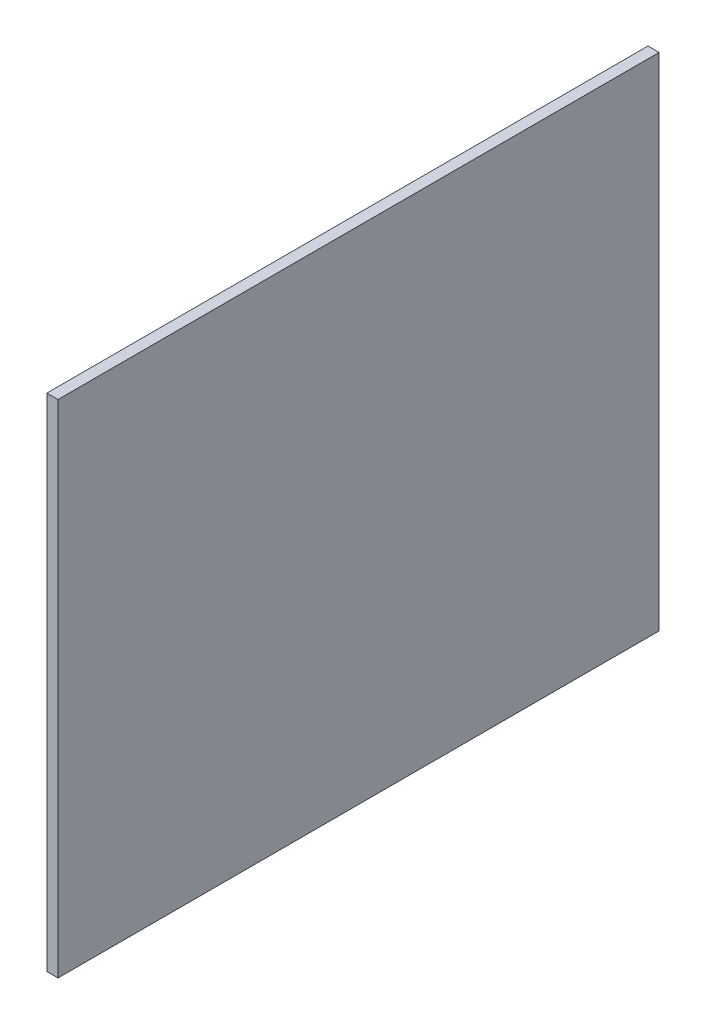
ISO-10303-21;
HEADER;
FILE_DESCRIPTION(('STEP AP214'),'2;1');
FILE_NAME('part.step','',(''),(''),'','','');
FILE_SCHEMA(('AUTOMOTIVE_DESIGN { 1 0 10303 214 1 1 1 1 }'));
ENDSEC;
DATA;
#1=APPLICATION_CONTEXT('core data for automotive mechanical design processes');
#2=APPLICATION_PROTOCOL_DEFINITION('international standard','automotive_design',2000,#1);
#3=PRODUCT_CONTEXT('',#1,'mechanical');
#4=PRODUCT('Part','Part','',(#3));
#5=PRODUCT_RELATED_PRODUCT_CATEGORY('part','',(#4));
#6=PRODUCT_DEFINITION_FORMATION('','',#4);
#7=PRODUCT_DEFINITION_CONTEXT('part definition',#1,'design');
#8=PRODUCT_DEFINITION('design','',#6,#7);
#9=PRODUCT_DEFINITION_SHAPE('','',#8);
#10=(LENGTH_UNIT() NAMED_UNIT(*) SI_UNIT(.MILLI.,.METRE.));
#11=(NAMED_UNIT(*) PLANE_ANGLE_UNIT() SI_UNIT($,.RADIAN.));
#12=(NAMED_UNIT(*) SI_UNIT($,.STERADIAN.) SOLID_ANGLE_UNIT());
#13=UNCERTAINTY_MEASURE_WITH_UNIT(LENGTH_MEASURE(1.E-05),#10,'distance_accuracy_value','');
#14=(GEOMETRIC_REPRESENTATION_CONTEXT(3) GLOBAL_UNCERTAINTY_ASSIGNED_CONTEXT((#13)) GLOBAL_UNIT_ASSIGNED_CONTEXT((#10,
#11,#12)) REPRESENTATION_CONTEXT('',''));
#15=CARTESIAN_POINT('',(0.,0.,0.));
#16=DIRECTION('',(0.,0.,1.));
#17=DIRECTION('',(1.,0.,0.));
#18=AXIS2_PLACEMENT_3D('',#15,#16,#17);
#19=CARTESIAN_POINT('',(8.,0.,0.));
#20=DIRECTION('',(0.,0.,-1.));
#21=DIRECTION('',(-1.,0.,0.));
#22=AXIS2_PLACEMENT_3D('',#19,#20,#21);
#23=PLANE('',#22);
#24=DIRECTION('',(0.,-1.,0.));
#25=VECTOR('',#24,1.);
#26=CARTESIAN_POINT('',(0.,0.,0.));
#27=LINE('',#26,#25);
#28=CARTESIAN_POINT('',(0.,360.,0.));
#29=VERTEX_POINT('',#28);
#30=CARTESIAN_POINT('',(0.,0.,0.));
#31=VERTEX_POINT('',#30);
#32=EDGE_CURVE('E96',#29,#31,#27,.T.);
#33=ORIENTED_EDGE('',*,*,#32,.T.);
#34=DIRECTION('',(-1.,0.,0.));
#35=VECTOR('',#34,1.);
#36=CARTESIAN_POINT('',(8.,0.,0.));
#37=LINE('',#36,#35);
#38=CARTESIAN_POINT('',(8.,0.,0.));
#39=VERTEX_POINT('',#38);
#40=EDGE_CURVE('E11',#39,#31,#37,.T.);
#41=ORIENTED_EDGE('',*,*,#40,.F.);
#42=DIRECTION('',(0.,-1.,0.));
#43=VECTOR('',#42,1.);
#44=CARTESIAN_POINT('',(8.,0.,0.));
#45=LINE('',#44,#43);
#46=CARTESIAN_POINT('',(8.,360.,0.));
#47=VERTEX_POINT('',#46);
#48=EDGE_CURVE('E84',#47,#39,#45,.T.);
#49=ORIENTED_EDGE('',*,*,#48,.F.);
#50=DIRECTION('',(-1.,0.,0.));
#51=VECTOR('',#50,1.);
#52=CARTESIAN_POINT('',(8.,360.,0.));
#53=LINE('',#52,#51);
#54=EDGE_CURVE('E92',#47,#29,#53,.T.);
#55=ORIENTED_EDGE('',*,*,#54,.T.);
#56=EDGE_LOOP('',(#33,#41,#49,#55));
#57=FACE_BOUND('',#56,.T.);
#58=ADVANCED_FACE('F33',(#57),#23,.F.);
#59=CARTESIAN_POINT('',(8.,0.,0.));
#60=DIRECTION('',(0.,1.,0.));
#61=DIRECTION('',(0.,0.,1.));
#62=AXIS2_PLACEMENT_3D('',#59,#60,#61);
#63=PLANE('',#62);
#64=DIRECTION('',(0.,0.,-1.));
#65=VECTOR('',#64,1.);
#66=CARTESIAN_POINT('',(0.,0.,0.));
#67=LINE('',#66,#65);
#68=CARTESIAN_POINT('',(0.,0.,-432.));
#69=VERTEX_POINT('',#68);
#70=EDGE_CURVE('E88',#31,#69,#67,.T.);
#71=ORIENTED_EDGE('',*,*,#70,.T.);
#72=DIRECTION('',(-1.,0.,0.));
#73=VECTOR('',#72,1.);
#74=CARTESIAN_POINT('',(8.,0.,-432.));
#75=LINE('',#74,#73);
#76=CARTESIAN_POINT('',(8.,0.,-432.));
#77=VERTEX_POINT('',#76);
#78=EDGE_CURVE('E41',#77,#69,#75,.T.);
#79=ORIENTED_EDGE('',*,*,#78,.F.);
#80=DIRECTION('',(0.,0.,-1.));
#81=VECTOR('',#80,1.);
#82=CARTESIAN_POINT('',(8.,0.,0.));
#83=LINE('',#82,#81);
#84=EDGE_CURVE('E79',#39,#77,#83,.T.);
#85=ORIENTED_EDGE('',*,*,#84,.F.);
#86=ORIENTED_EDGE('',*,*,#40,.T.);
#87=EDGE_LOOP('',(#71,#79,#85,#86));
#88=FACE_BOUND('',#87,.T.);
#89=ADVANCED_FACE('F87',(#88),#63,.F.);
#90=CARTESIAN_POINT('',(8.,0.,-432.));
#91=DIRECTION('',(0.,0.,1.));
#92=DIRECTION('',(1.,0.,0.));
#93=AXIS2_PLACEMENT_3D('',#90,#91,#92);
#94=PLANE('',#93);
#95=DIRECTION('',(0.,1.,0.));
#96=VECTOR('',#95,1.);
#97=CARTESIAN_POINT('',(0.,0.,-432.));
#98=LINE('',#97,#96);
#99=CARTESIAN_POINT('',(0.,360.,-432.));
#100=VERTEX_POINT('',#99);
#101=EDGE_CURVE('E66',#69,#100,#98,.T.);
#102=ORIENTED_EDGE('',*,*,#101,.T.);
#103=DIRECTION('',(-1.,0.,0.));
#104=VECTOR('',#103,1.);
#105=CARTESIAN_POINT('',(8.,360.,-432.));
#106=LINE('',#105,#104);
#107=CARTESIAN_POINT('',(8.,360.,-432.));
#108=VERTEX_POINT('',#107);
#109=EDGE_CURVE('E89',#108,#100,#106,.T.);
#110=ORIENTED_EDGE('',*,*,#109,.F.);
#111=DIRECTION('',(0.,1.,0.));
#112=VECTOR('',#111,1.);
#113=CARTESIAN_POINT('',(8.,0.,-432.));
#114=LINE('',#113,#112);
#115=EDGE_CURVE('E82',#77,#108,#114,.T.);
#116=ORIENTED_EDGE('',*,*,#115,.F.);
#117=ORIENTED_EDGE('',*,*,#78,.T.);
#118=EDGE_LOOP('',(#102,#110,#116,#117));
#119=FACE_BOUND('',#118,.T.);
#120=ADVANCED_FACE('F90',(#119),#94,.F.);
#121=CARTESIAN_POINT('',(8.,360.,0.));
#122=DIRECTION('',(0.,-1.,0.));
#123=DIRECTION('',(0.,0.,-1.));
#124=AXIS2_PLACEMENT_3D('',#121,#122,#123);
#125=PLANE('',#124);
#126=DIRECTION('',(0.,0.,1.));
#127=VECTOR('',#126,1.);
#128=CARTESIAN_POINT('',(0.,360.,0.));
#129=LINE('',#128,#127);
#130=EDGE_CURVE('E72',#100,#29,#129,.T.);
#131=ORIENTED_EDGE('',*,*,#130,.T.);
#132=ORIENTED_EDGE('',*,*,#54,.F.);
#133=DIRECTION('',(0.,0.,1.));
#134=VECTOR('',#133,1.);
#135=CARTESIAN_POINT('',(8.,360.,0.));
#136=LINE('',#135,#134);
#137=EDGE_CURVE('E49',#108,#47,#136,.T.);
#138=ORIENTED_EDGE('',*,*,#137,.F.);
#139=ORIENTED_EDGE('',*,*,#109,.T.);
#140=EDGE_LOOP('',(#131,#132,#138,#139));
#141=FACE_BOUND('',#140,.T.);
#142=ADVANCED_FACE('F103',(#141),#125,.F.);
#143=CARTESIAN_POINT('',(8.,0.,0.));
#144=DIRECTION('',(-1.,0.,0.));
#145=DIRECTION('',(0.,0.,1.));
#146=AXIS2_PLACEMENT_3D('',#143,#144,#145);
#147=PLANE('',#146);
#148=ORIENTED_EDGE('',*,*,#48,.T.);
#149=ORIENTED_EDGE('',*,*,#84,.T.);
#150=ORIENTED_EDGE('',*,*,#115,.T.);
#151=ORIENTED_EDGE('',*,*,#137,.T.);
#152=EDGE_LOOP('',(#148,#149,#150,#151));
#153=FACE_BOUND('',#152,.T.);
#154=ADVANCED_FACE('F80',(#153),#147,.F.);
#155=CARTESIAN_POINT('',(0.,0.,0.));
#156=DIRECTION('',(-1.,0.,0.));
#157=DIRECTION('',(0.,0.,1.));
#158=AXIS2_PLACEMENT_3D('',#155,#156,#157);
#159=PLANE('',#158);
#160=ORIENTED_EDGE('',*,*,#32,.F.);
#161=ORIENTED_EDGE('',*,*,#130,.F.);
#162=ORIENTED_EDGE('',*,*,#101,.F.);
#163=ORIENTED_EDGE('',*,*,#70,.F.);
#164=EDGE_LOOP('',(#160,#161,#162,#163));
#165=FACE_BOUND('',#164,.T.);
#166=ADVANCED_FACE('F106',(#165),#159,.T.);
#167=CLOSED_SHELL('',(#58,#89,#120,#142,#154,#166));
#168=MANIFOLD_SOLID_BREP('B2',#167);
#169=ADVANCED_BREP_SHAPE_REPRESENTATION('',(#18,#168),#14);
#170=SHAPE_DEFINITION_REPRESENTATION(#9,#169);
ENDSEC;
END-ISO-10303-21;
